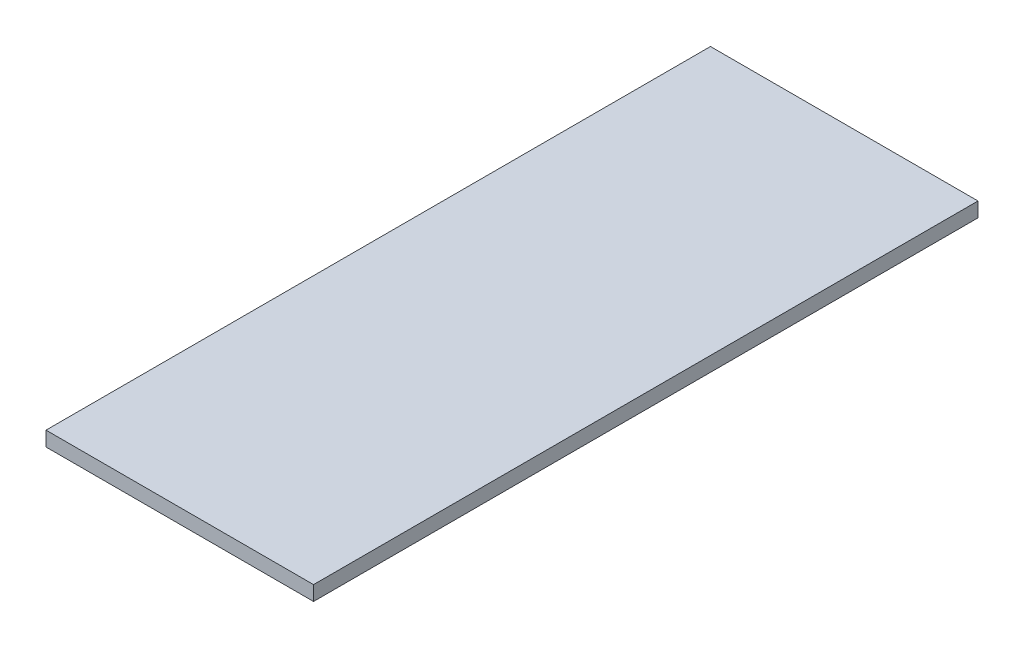
ISO-10303-21;
HEADER;
FILE_DESCRIPTION(('STEP AP214'),'2;1');
FILE_NAME('part.step','',(''),(''),'','','');
FILE_SCHEMA(('AUTOMOTIVE_DESIGN { 1 0 10303 214 1 1 1 1 }'));
ENDSEC;
DATA;
#1=APPLICATION_CONTEXT('core data for automotive mechanical design processes');
#2=APPLICATION_PROTOCOL_DEFINITION('international standard','automotive_design',2000,#1);
#3=PRODUCT_CONTEXT('',#1,'mechanical');
#4=PRODUCT('Part','Part','',(#3));
#5=PRODUCT_RELATED_PRODUCT_CATEGORY('part','',(#4));
#6=PRODUCT_DEFINITION_FORMATION('','',#4);
#7=PRODUCT_DEFINITION_CONTEXT('part definition',#1,'design');
#8=PRODUCT_DEFINITION('design','',#6,#7);
#9=PRODUCT_DEFINITION_SHAPE('','',#8);
#10=(LENGTH_UNIT() NAMED_UNIT(*) SI_UNIT(.MILLI.,.METRE.));
#11=(NAMED_UNIT(*) PLANE_ANGLE_UNIT() SI_UNIT($,.RADIAN.));
#12=(NAMED_UNIT(*) SI_UNIT($,.STERADIAN.) SOLID_ANGLE_UNIT());
#13=UNCERTAINTY_MEASURE_WITH_UNIT(LENGTH_MEASURE(1.E-05),#10,'distance_accuracy_value','');
#14=(GEOMETRIC_REPRESENTATION_CONTEXT(3) GLOBAL_UNCERTAINTY_ASSIGNED_CONTEXT((#13)) GLOBAL_UNIT_ASSIGNED_CONTEXT((#10,
#11,#12)) REPRESENTATION_CONTEXT('',''));
#15=CARTESIAN_POINT('',(0.,0.,0.));
#16=DIRECTION('',(0.,0.,1.));
#17=DIRECTION('',(1.,0.,0.));
#18=AXIS2_PLACEMENT_3D('',#15,#16,#17);
#19=CARTESIAN_POINT('',(9.13999999999999,1.,-20.4000000000001));
#20=DIRECTION('',(-1.,0.,0.));
#21=DIRECTION('',(0.,0.,1.));
#22=AXIS2_PLACEMENT_3D('',#19,#20,#21);
#23=PLANE('',#22);
#24=DIRECTION('',(0.,0.,-1.));
#25=VECTOR('',#24,1.);
#26=CARTESIAN_POINT('',(9.13999999999999,0.,-20.4000000000001));
#27=LINE('',#26,#25);
#28=CARTESIAN_POINT('',(9.14,0.,25.));
#29=VERTEX_POINT('',#28);
#30=CARTESIAN_POINT('',(9.13999999999999,0.,-20.4000000000001));
#31=VERTEX_POINT('',#30);
#32=EDGE_CURVE('E98',#29,#31,#27,.T.);
#33=ORIENTED_EDGE('',*,*,#32,.T.);
#34=DIRECTION('',(0.,-1.,0.));
#35=VECTOR('',#34,1.);
#36=CARTESIAN_POINT('',(9.13999999999999,1.,-20.4000000000001));
#37=LINE('',#36,#35);
#38=CARTESIAN_POINT('',(9.13999999999999,1.,-20.4000000000001));
#39=VERTEX_POINT('',#38);
#40=EDGE_CURVE('E11',#39,#31,#37,.T.);
#41=ORIENTED_EDGE('',*,*,#40,.F.);
#42=DIRECTION('',(0.,0.,-1.));
#43=VECTOR('',#42,1.);
#44=CARTESIAN_POINT('',(9.13999999999999,1.,-20.4000000000001));
#45=LINE('',#44,#43);
#46=CARTESIAN_POINT('',(9.14,1.,25.));
#47=VERTEX_POINT('',#46);
#48=EDGE_CURVE('E86',#47,#39,#45,.T.);
#49=ORIENTED_EDGE('',*,*,#48,.F.);
#50=DIRECTION('',(0.,-1.,0.));
#51=VECTOR('',#50,1.);
#52=CARTESIAN_POINT('',(9.14,1.,25.));
#53=LINE('',#52,#51);
#54=EDGE_CURVE('E94',#47,#29,#53,.T.);
#55=ORIENTED_EDGE('',*,*,#54,.T.);
#56=EDGE_LOOP('',(#33,#41,#49,#55));
#57=FACE_BOUND('',#56,.T.);
#58=ADVANCED_FACE('F35',(#57),#23,.F.);
#59=CARTESIAN_POINT('',(-9.14,1.,-20.4000000000001));
#60=DIRECTION('',(0.,0.,1.));
#61=DIRECTION('',(1.,0.,0.));
#62=AXIS2_PLACEMENT_3D('',#59,#60,#61);
#63=PLANE('',#62);
#64=DIRECTION('',(-1.,0.,0.));
#65=VECTOR('',#64,1.);
#66=CARTESIAN_POINT('',(-9.14,0.,-20.4000000000001));
#67=LINE('',#66,#65);
#68=CARTESIAN_POINT('',(-9.14,0.,-20.4000000000001));
#69=VERTEX_POINT('',#68);
#70=EDGE_CURVE('E90',#31,#69,#67,.T.);
#71=ORIENTED_EDGE('',*,*,#70,.T.);
#72=DIRECTION('',(0.,-1.,0.));
#73=VECTOR('',#72,1.);
#74=CARTESIAN_POINT('',(-9.14,1.,-20.4000000000001));
#75=LINE('',#74,#73);
#76=CARTESIAN_POINT('',(-9.14,1.,-20.4000000000001));
#77=VERTEX_POINT('',#76);
#78=EDGE_CURVE('E43',#77,#69,#75,.T.);
#79=ORIENTED_EDGE('',*,*,#78,.F.);
#80=DIRECTION('',(-1.,0.,0.));
#81=VECTOR('',#80,1.);
#82=CARTESIAN_POINT('',(-9.14,1.,-20.4000000000001));
#83=LINE('',#82,#81);
#84=EDGE_CURVE('E81',#39,#77,#83,.T.);
#85=ORIENTED_EDGE('',*,*,#84,.F.);
#86=ORIENTED_EDGE('',*,*,#40,.T.);
#87=EDGE_LOOP('',(#71,#79,#85,#86));
#88=FACE_BOUND('',#87,.T.);
#89=ADVANCED_FACE('F89',(#88),#63,.F.);
#90=CARTESIAN_POINT('',(-9.14,1.,-20.4000000000001));
#91=DIRECTION('',(1.,0.,0.));
#92=DIRECTION('',(0.,0.,-1.));
#93=AXIS2_PLACEMENT_3D('',#90,#91,#92);
#94=PLANE('',#93);
#95=DIRECTION('',(0.,0.,1.));
#96=VECTOR('',#95,1.);
#97=CARTESIAN_POINT('',(-9.14,0.,-20.4000000000001));
#98=LINE('',#97,#96);
#99=CARTESIAN_POINT('',(-9.14,0.,25.));
#100=VERTEX_POINT('',#99);
#101=EDGE_CURVE('E68',#69,#100,#98,.T.);
#102=ORIENTED_EDGE('',*,*,#101,.T.);
#103=DIRECTION('',(0.,-1.,0.));
#104=VECTOR('',#103,1.);
#105=CARTESIAN_POINT('',(-9.14,1.,25.));
#106=LINE('',#105,#104);
#107=CARTESIAN_POINT('',(-9.14,1.,25.));
#108=VERTEX_POINT('',#107);
#109=EDGE_CURVE('E91',#108,#100,#106,.T.);
#110=ORIENTED_EDGE('',*,*,#109,.F.);
#111=DIRECTION('',(0.,0.,1.));
#112=VECTOR('',#111,1.);
#113=CARTESIAN_POINT('',(-9.14,1.,-20.4000000000001));
#114=LINE('',#113,#112);
#115=EDGE_CURVE('E84',#77,#108,#114,.T.);
#116=ORIENTED_EDGE('',*,*,#115,.F.);
#117=ORIENTED_EDGE('',*,*,#78,.T.);
#118=EDGE_LOOP('',(#102,#110,#116,#117));
#119=FACE_BOUND('',#118,.T.);
#120=ADVANCED_FACE('F92',(#119),#94,.F.);
#121=CARTESIAN_POINT('',(-9.14,1.,25.));
#122=DIRECTION('',(0.,0.,-1.));
#123=DIRECTION('',(-1.,0.,0.));
#124=AXIS2_PLACEMENT_3D('',#121,#122,#123);
#125=PLANE('',#124);
#126=DIRECTION('',(1.,0.,0.));
#127=VECTOR('',#126,1.);
#128=CARTESIAN_POINT('',(-9.14,0.,25.));
#129=LINE('',#128,#127);
#130=EDGE_CURVE('E74',#100,#29,#129,.T.);
#131=ORIENTED_EDGE('',*,*,#130,.T.);
#132=ORIENTED_EDGE('',*,*,#54,.F.);
#133=DIRECTION('',(1.,0.,0.));
#134=VECTOR('',#133,1.);
#135=CARTESIAN_POINT('',(-9.14,1.,25.));
#136=LINE('',#135,#134);
#137=EDGE_CURVE('E51',#108,#47,#136,.T.);
#138=ORIENTED_EDGE('',*,*,#137,.F.);
#139=ORIENTED_EDGE('',*,*,#109,.T.);
#140=EDGE_LOOP('',(#131,#132,#138,#139));
#141=FACE_BOUND('',#140,.T.);
#142=ADVANCED_FACE('F105',(#141),#125,.F.);
#143=CARTESIAN_POINT('',(0.,1.,0.));
#144=DIRECTION('',(0.,1.,0.));
#145=DIRECTION('',(0.,0.,1.));
#146=AXIS2_PLACEMENT_3D('',#143,#144,#145);
#147=PLANE('',#146);
#148=ORIENTED_EDGE('',*,*,#48,.T.);
#149=ORIENTED_EDGE('',*,*,#84,.T.);
#150=ORIENTED_EDGE('',*,*,#115,.T.);
#151=ORIENTED_EDGE('',*,*,#137,.T.);
#152=EDGE_LOOP('',(#148,#149,#150,#151));
#153=FACE_BOUND('',#152,.T.);
#154=ADVANCED_FACE('F82',(#153),#147,.T.);
#155=CARTESIAN_POINT('',(0.,0.,0.));
#156=DIRECTION('',(0.,1.,0.));
#157=DIRECTION('',(0.,0.,1.));
#158=AXIS2_PLACEMENT_3D('',#155,#156,#157);
#159=PLANE('',#158);
#160=ORIENTED_EDGE('',*,*,#32,.F.);
#161=ORIENTED_EDGE('',*,*,#130,.F.);
#162=ORIENTED_EDGE('',*,*,#101,.F.);
#163=ORIENTED_EDGE('',*,*,#70,.F.);
#164=EDGE_LOOP('',(#160,#161,#162,#163));
#165=FACE_BOUND('',#164,.T.);
#166=ADVANCED_FACE('F108',(#165),#159,.F.);
#167=CLOSED_SHELL('',(#58,#89,#120,#142,#154,#166));
#168=MANIFOLD_SOLID_BREP('B2',#167);
#169=ADVANCED_BREP_SHAPE_REPRESENTATION('',(#18,#168),#14);
#170=SHAPE_DEFINITION_REPRESENTATION(#9,#169);
ENDSEC;
END-ISO-10303-21;
